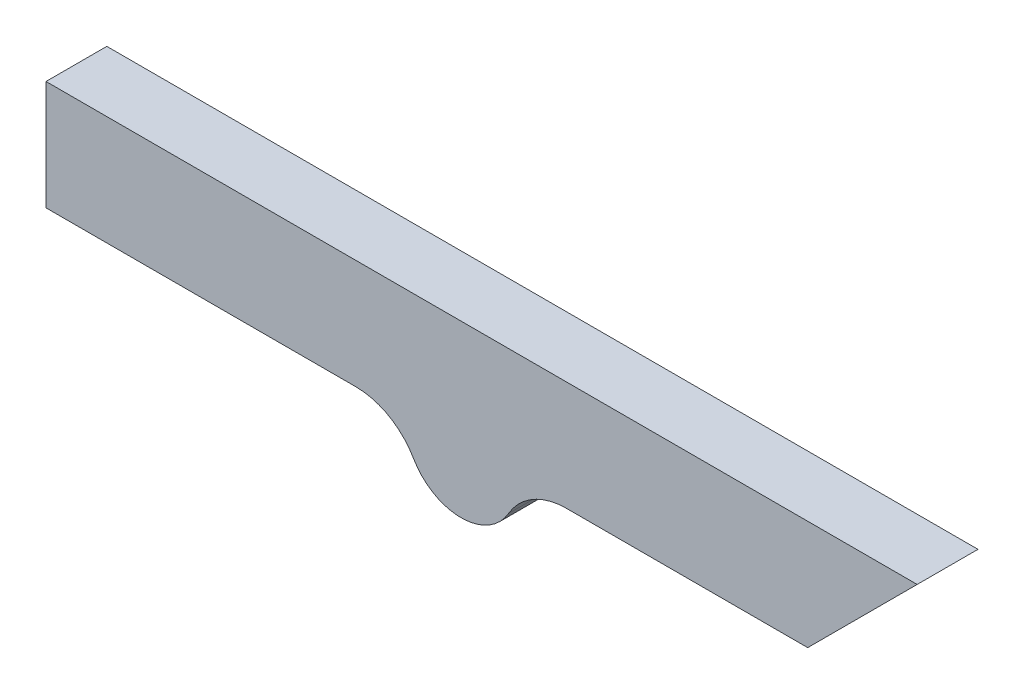
ISO-10303-21;
HEADER;
FILE_DESCRIPTION(('STEP AP214'),'2;1');
FILE_NAME('part.step','',(''),(''),'','','');
FILE_SCHEMA(('AUTOMOTIVE_DESIGN { 1 0 10303 214 1 1 1 1 }'));
ENDSEC;
DATA;
#1=APPLICATION_CONTEXT('core data for automotive mechanical design processes');
#2=APPLICATION_PROTOCOL_DEFINITION('international standard','automotive_design',2000,#1);
#3=PRODUCT_CONTEXT('',#1,'mechanical');
#4=PRODUCT('Part','Part','',(#3));
#5=PRODUCT_RELATED_PRODUCT_CATEGORY('part','',(#4));
#6=PRODUCT_DEFINITION_FORMATION('','',#4);
#7=PRODUCT_DEFINITION_CONTEXT('part definition',#1,'design');
#8=PRODUCT_DEFINITION('design','',#6,#7);
#9=PRODUCT_DEFINITION_SHAPE('','',#8);
#10=(LENGTH_UNIT() NAMED_UNIT(*) SI_UNIT(.MILLI.,.METRE.));
#11=(NAMED_UNIT(*) PLANE_ANGLE_UNIT() SI_UNIT($,.RADIAN.));
#12=(NAMED_UNIT(*) SI_UNIT($,.STERADIAN.) SOLID_ANGLE_UNIT());
#13=UNCERTAINTY_MEASURE_WITH_UNIT(LENGTH_MEASURE(1.E-05),#10,'distance_accuracy_value','');
#14=(GEOMETRIC_REPRESENTATION_CONTEXT(3) GLOBAL_UNCERTAINTY_ASSIGNED_CONTEXT((#13)) GLOBAL_UNIT_ASSIGNED_CONTEXT((#10,
#11,#12)) REPRESENTATION_CONTEXT('',''));
#15=CARTESIAN_POINT('',(0.,0.,0.));
#16=DIRECTION('',(0.,0.,1.));
#17=DIRECTION('',(1.,0.,0.));
#18=AXIS2_PLACEMENT_3D('',#15,#16,#17);
#19=CARTESIAN_POINT('',(17.3070508075689,10.2750000000001,1.));
#20=DIRECTION('',(0.,0.,-1.));
#21=DIRECTION('',(-1.,0.,0.));
#22=AXIS2_PLACEMENT_3D('',#19,#20,#21);
#23=CYLINDRICAL_SURFACE('',#22,1.1);
#24=CARTESIAN_POINT('',(17.3070508075689,10.2750000000001,0.));
#25=DIRECTION('',(0.,0.,1.));
#26=DIRECTION('',(1.,0.,0.));
#27=AXIS2_PLACEMENT_3D('',#24,#25,#26);
#28=CIRCLE('',#27,1.1);
#29=CARTESIAN_POINT('',(17.3070508075689,11.3750000000001,0.));
#30=VERTEX_POINT('',#29);
#31=CARTESIAN_POINT('',(16.354422863406,10.8250000000001,0.));
#32=VERTEX_POINT('',#31);
#33=EDGE_CURVE('E128',#30,#32,#28,.T.);
#34=ORIENTED_EDGE('',*,*,#33,.F.);
#35=DIRECTION('',(0.,0.,-1.));
#36=VECTOR('',#35,1.);
#37=CARTESIAN_POINT('',(17.3070508075689,11.3750000000001,1.));
#38=LINE('',#37,#36);
#39=CARTESIAN_POINT('',(17.3070508075689,11.3750000000001,1.));
#40=VERTEX_POINT('',#39);
#41=EDGE_CURVE('E11',#40,#30,#38,.T.);
#42=ORIENTED_EDGE('',*,*,#41,.F.);
#43=CARTESIAN_POINT('',(17.3070508075689,10.2750000000001,1.));
#44=DIRECTION('',(0.,0.,1.));
#45=DIRECTION('',(1.,0.,0.));
#46=AXIS2_PLACEMENT_3D('',#43,#44,#45);
#47=CIRCLE('',#46,1.1);
#48=CARTESIAN_POINT('',(16.354422863406,10.8250000000001,1.));
#49=VERTEX_POINT('',#48);
#50=EDGE_CURVE('E144',#40,#49,#47,.T.);
#51=ORIENTED_EDGE('',*,*,#50,.T.);
#52=DIRECTION('',(0.,0.,-1.));
#53=VECTOR('',#52,1.);
#54=CARTESIAN_POINT('',(16.354422863406,10.8250000000001,1.));
#55=LINE('',#54,#53);
#56=EDGE_CURVE('E84',#49,#32,#55,.T.);
#57=ORIENTED_EDGE('',*,*,#56,.T.);
#58=EDGE_LOOP('',(#34,#42,#51,#57));
#59=FACE_BOUND('',#58,.T.);
#60=ADVANCED_FACE('F34',(#59),#23,.F.);
#61=CARTESIAN_POINT('',(0.,11.3750000000001,1.));
#62=DIRECTION('',(0.,1.,0.));
#63=DIRECTION('',(-1.,0.,0.));
#64=AXIS2_PLACEMENT_3D('',#61,#62,#63);
#65=PLANE('',#64);
#66=DIRECTION('',(1.,0.,0.));
#67=VECTOR('',#66,1.);
#68=CARTESIAN_POINT('',(0.,11.3750000000001,0.));
#69=LINE('',#68,#67);
#70=CARTESIAN_POINT('',(21.2744949366118,11.3750000000001,0.));
#71=VERTEX_POINT('',#70);
#72=EDGE_CURVE('E131',#30,#71,#69,.T.);
#73=ORIENTED_EDGE('',*,*,#72,.T.);
#74=DIRECTION('',(0.,0.,-1.));
#75=VECTOR('',#74,1.);
#76=CARTESIAN_POINT('',(21.2744949366118,11.3750000000001,1.));
#77=LINE('',#76,#75);
#78=CARTESIAN_POINT('',(21.2744949366118,11.3750000000001,1.));
#79=VERTEX_POINT('',#78);
#80=EDGE_CURVE('E42',#79,#71,#77,.T.);
#81=ORIENTED_EDGE('',*,*,#80,.F.);
#82=DIRECTION('',(1.,0.,0.));
#83=VECTOR('',#82,1.);
#84=CARTESIAN_POINT('',(0.,11.3750000000001,1.));
#85=LINE('',#84,#83);
#86=EDGE_CURVE('E177',#40,#79,#85,.T.);
#87=ORIENTED_EDGE('',*,*,#86,.F.);
#88=ORIENTED_EDGE('',*,*,#41,.T.);
#89=EDGE_LOOP('',(#73,#81,#87,#88));
#90=FACE_BOUND('',#89,.T.);
#91=ADVANCED_FACE('F179',(#90),#65,.F.);
#92=CARTESIAN_POINT('',(4.94974746830591,-4.94974746830588,1.));
#93=DIRECTION('',(-0.707106781186549,0.707106781186546,0.));
#94=DIRECTION('',(-0.707106781186546,-0.707106781186549,0.));
#95=AXIS2_PLACEMENT_3D('',#92,#93,#94);
#96=PLANE('',#95);
#97=DIRECTION('',(0.707106781186546,0.707106781186549,0.));
#98=VECTOR('',#97,1.);
#99=CARTESIAN_POINT('',(4.94974746830591,-4.94974746830588,0.));
#100=LINE('',#99,#98);
#101=CARTESIAN_POINT('',(23.0744949366117,13.175,0.));
#102=VERTEX_POINT('',#101);
#103=EDGE_CURVE('E133',#71,#102,#100,.T.);
#104=ORIENTED_EDGE('',*,*,#103,.T.);
#105=DIRECTION('',(0.,0.,-1.));
#106=VECTOR('',#105,1.);
#107=CARTESIAN_POINT('',(23.0744949366117,13.175,1.));
#108=LINE('',#107,#106);
#109=CARTESIAN_POINT('',(23.0744949366117,13.175,1.));
#110=VERTEX_POINT('',#109);
#111=EDGE_CURVE('E151',#110,#102,#108,.T.);
#112=ORIENTED_EDGE('',*,*,#111,.F.);
#113=DIRECTION('',(0.707106781186546,0.707106781186549,0.));
#114=VECTOR('',#113,1.);
#115=CARTESIAN_POINT('',(4.94974746830591,-4.94974746830588,1.));
#116=LINE('',#115,#114);
#117=EDGE_CURVE('E160',#79,#110,#116,.T.);
#118=ORIENTED_EDGE('',*,*,#117,.F.);
#119=ORIENTED_EDGE('',*,*,#80,.T.);
#120=EDGE_LOOP('',(#104,#112,#118,#119));
#121=FACE_BOUND('',#120,.T.);
#122=ADVANCED_FACE('F158',(#121),#96,.F.);
#123=CARTESIAN_POINT('',(0.,13.175,1.));
#124=DIRECTION('',(0.,-1.,0.));
#125=DIRECTION('',(0.,0.,-1.));
#126=AXIS2_PLACEMENT_3D('',#123,#124,#125);
#127=PLANE('',#126);
#128=DIRECTION('',(-1.,0.,0.));
#129=VECTOR('',#128,1.);
#130=CARTESIAN_POINT('',(0.,13.175,0.));
#131=LINE('',#130,#129);
#132=CARTESIAN_POINT('',(8.75000000000008,13.175,0.));
#133=VERTEX_POINT('',#132);
#134=EDGE_CURVE('E135',#102,#133,#131,.T.);
#135=ORIENTED_EDGE('',*,*,#134,.T.);
#136=DIRECTION('',(0.,0.,-1.));
#137=VECTOR('',#136,1.);
#138=CARTESIAN_POINT('',(8.75000000000008,13.175,1.));
#139=LINE('',#138,#137);
#140=CARTESIAN_POINT('',(8.75000000000008,13.175,1.));
#141=VERTEX_POINT('',#140);
#142=EDGE_CURVE('E148',#141,#133,#139,.T.);
#143=ORIENTED_EDGE('',*,*,#142,.F.);
#144=DIRECTION('',(-1.,0.,0.));
#145=VECTOR('',#144,1.);
#146=CARTESIAN_POINT('',(0.,13.175,1.));
#147=LINE('',#146,#145);
#148=EDGE_CURVE('E173',#110,#141,#147,.T.);
#149=ORIENTED_EDGE('',*,*,#148,.F.);
#150=ORIENTED_EDGE('',*,*,#111,.T.);
#151=EDGE_LOOP('',(#135,#143,#149,#150));
#152=FACE_BOUND('',#151,.T.);
#153=ADVANCED_FACE('F169',(#152),#127,.F.);
#154=CARTESIAN_POINT('',(8.75000000000008,0.,1.));
#155=DIRECTION('',(1.,0.,0.));
#156=DIRECTION('',(0.,0.,-1.));
#157=AXIS2_PLACEMENT_3D('',#154,#155,#156);
#158=PLANE('',#157);
#159=DIRECTION('',(0.,-1.,0.));
#160=VECTOR('',#159,1.);
#161=CARTESIAN_POINT('',(8.75000000000008,0.,0.));
#162=LINE('',#161,#160);
#163=CARTESIAN_POINT('',(8.75000000000008,11.3750000000001,0.));
#164=VERTEX_POINT('',#163);
#165=EDGE_CURVE('E137',#133,#164,#162,.T.);
#166=ORIENTED_EDGE('',*,*,#165,.T.);
#167=DIRECTION('',(0.,0.,-1.));
#168=VECTOR('',#167,1.);
#169=CARTESIAN_POINT('',(8.75000000000008,11.3750000000001,1.));
#170=LINE('',#169,#168);
#171=CARTESIAN_POINT('',(8.75000000000008,11.3750000000001,1.));
#172=VERTEX_POINT('',#171);
#173=EDGE_CURVE('E121',#172,#164,#170,.T.);
#174=ORIENTED_EDGE('',*,*,#173,.F.);
#175=DIRECTION('',(0.,-1.,0.));
#176=VECTOR('',#175,1.);
#177=CARTESIAN_POINT('',(8.75000000000008,0.,1.));
#178=LINE('',#177,#176);
#179=EDGE_CURVE('E108',#141,#172,#178,.T.);
#180=ORIENTED_EDGE('',*,*,#179,.F.);
#181=ORIENTED_EDGE('',*,*,#142,.T.);
#182=EDGE_LOOP('',(#166,#174,#180,#181));
#183=FACE_BOUND('',#182,.T.);
#184=ADVANCED_FACE('F172',(#183),#158,.F.);
#185=CARTESIAN_POINT('',(0.,11.375,1.));
#186=DIRECTION('',(0.,1.,0.));
#187=DIRECTION('',(0.,0.,1.));
#188=AXIS2_PLACEMENT_3D('',#185,#186,#187);
#189=PLANE('',#188);
#190=DIRECTION('',(1.,0.,0.));
#191=VECTOR('',#190,1.);
#192=CARTESIAN_POINT('',(0.,11.375,0.));
#193=LINE('',#192,#191);
#194=CARTESIAN_POINT('',(13.8429491924311,11.375,0.));
#195=VERTEX_POINT('',#194);
#196=EDGE_CURVE('E117',#164,#195,#193,.T.);
#197=ORIENTED_EDGE('',*,*,#196,.T.);
#198=DIRECTION('',(0.,0.,-1.));
#199=VECTOR('',#198,1.);
#200=CARTESIAN_POINT('',(13.8429491924311,11.375,1.));
#201=LINE('',#200,#199);
#202=CARTESIAN_POINT('',(13.8429491924311,11.375,1.));
#203=VERTEX_POINT('',#202);
#204=EDGE_CURVE('E114',#203,#195,#201,.T.);
#205=ORIENTED_EDGE('',*,*,#204,.F.);
#206=DIRECTION('',(1.,0.,0.));
#207=VECTOR('',#206,1.);
#208=CARTESIAN_POINT('',(0.,11.375,1.));
#209=LINE('',#208,#207);
#210=EDGE_CURVE('E102',#172,#203,#209,.T.);
#211=ORIENTED_EDGE('',*,*,#210,.F.);
#212=ORIENTED_EDGE('',*,*,#173,.T.);
#213=EDGE_LOOP('',(#197,#205,#211,#212));
#214=FACE_BOUND('',#213,.T.);
#215=ADVANCED_FACE('F115',(#214),#189,.F.);
#216=CARTESIAN_POINT('',(13.8429491924311,10.2750000000001,1.));
#217=DIRECTION('',(0.,0.,-1.));
#218=DIRECTION('',(-1.,0.,0.));
#219=AXIS2_PLACEMENT_3D('',#216,#217,#218);
#220=CYLINDRICAL_SURFACE('',#219,1.09999999999999);
#221=CARTESIAN_POINT('',(13.8429491924311,10.2750000000001,0.));
#222=DIRECTION('',(0.,0.,1.));
#223=DIRECTION('',(1.,0.,0.));
#224=AXIS2_PLACEMENT_3D('',#221,#222,#223);
#225=CIRCLE('',#224,1.09999999999999);
#226=CARTESIAN_POINT('',(14.795577136594,10.8250000000001,0.));
#227=VERTEX_POINT('',#226);
#228=EDGE_CURVE('E140',#227,#195,#225,.T.);
#229=ORIENTED_EDGE('',*,*,#228,.F.);
#230=DIRECTION('',(0.,0.,-1.));
#231=VECTOR('',#230,1.);
#232=CARTESIAN_POINT('',(14.795577136594,10.8250000000001,1.));
#233=LINE('',#232,#231);
#234=CARTESIAN_POINT('',(14.795577136594,10.8250000000001,1.));
#235=VERTEX_POINT('',#234);
#236=EDGE_CURVE('E77',#235,#227,#233,.T.);
#237=ORIENTED_EDGE('',*,*,#236,.F.);
#238=CARTESIAN_POINT('',(13.8429491924311,10.2750000000001,1.));
#239=DIRECTION('',(0.,0.,1.));
#240=DIRECTION('',(1.,0.,0.));
#241=AXIS2_PLACEMENT_3D('',#238,#239,#240);
#242=CIRCLE('',#241,1.09999999999999);
#243=EDGE_CURVE('E106',#235,#203,#242,.T.);
#244=ORIENTED_EDGE('',*,*,#243,.T.);
#245=ORIENTED_EDGE('',*,*,#204,.T.);
#246=EDGE_LOOP('',(#229,#237,#244,#245));
#247=FACE_BOUND('',#246,.T.);
#248=ADVANCED_FACE('F123',(#247),#220,.F.);
#249=CARTESIAN_POINT('',(15.575,11.2750000000001,1.));
#250=DIRECTION('',(0.,0.,-1.));
#251=DIRECTION('',(-1.,0.,0.));
#252=AXIS2_PLACEMENT_3D('',#249,#250,#251);
#253=CYLINDRICAL_SURFACE('',#252,0.900000000000001);
#254=CARTESIAN_POINT('',(15.575,11.2750000000001,0.));
#255=DIRECTION('',(0.,0.,1.));
#256=DIRECTION('',(1.,0.,0.));
#257=AXIS2_PLACEMENT_3D('',#254,#255,#256);
#258=CIRCLE('',#257,0.900000000000001);
#259=EDGE_CURVE('E142',#227,#32,#258,.T.);
#260=ORIENTED_EDGE('',*,*,#259,.T.);
#261=ORIENTED_EDGE('',*,*,#56,.F.);
#262=CARTESIAN_POINT('',(15.575,11.2750000000001,1.));
#263=DIRECTION('',(0.,0.,1.));
#264=DIRECTION('',(1.,0.,0.));
#265=AXIS2_PLACEMENT_3D('',#262,#263,#264);
#266=CIRCLE('',#265,0.900000000000001);
#267=EDGE_CURVE('E50',#235,#49,#266,.T.);
#268=ORIENTED_EDGE('',*,*,#267,.F.);
#269=ORIENTED_EDGE('',*,*,#236,.T.);
#270=EDGE_LOOP('',(#260,#261,#268,#269));
#271=FACE_BOUND('',#270,.T.);
#272=ADVANCED_FACE('F195',(#271),#253,.T.);
#273=CARTESIAN_POINT('',(0.,0.,1.));
#274=DIRECTION('',(0.,0.,1.));
#275=DIRECTION('',(1.,0.,0.));
#276=AXIS2_PLACEMENT_3D('',#273,#274,#275);
#277=PLANE('',#276);
#278=ORIENTED_EDGE('',*,*,#50,.F.);
#279=ORIENTED_EDGE('',*,*,#86,.T.);
#280=ORIENTED_EDGE('',*,*,#117,.T.);
#281=ORIENTED_EDGE('',*,*,#148,.T.);
#282=ORIENTED_EDGE('',*,*,#179,.T.);
#283=ORIENTED_EDGE('',*,*,#210,.T.);
#284=ORIENTED_EDGE('',*,*,#243,.F.);
#285=ORIENTED_EDGE('',*,*,#267,.T.);
#286=EDGE_LOOP('',(#278,#279,#280,#281,#282,#283,#284,#285));
#287=FACE_BOUND('',#286,.T.);
#288=ADVANCED_FACE('F104',(#287),#277,.T.);
#289=CARTESIAN_POINT('',(0.,0.,0.));
#290=DIRECTION('',(0.,0.,1.));
#291=DIRECTION('',(1.,0.,0.));
#292=AXIS2_PLACEMENT_3D('',#289,#290,#291);
#293=PLANE('',#292);
#294=ORIENTED_EDGE('',*,*,#33,.T.);
#295=ORIENTED_EDGE('',*,*,#259,.F.);
#296=ORIENTED_EDGE('',*,*,#228,.T.);
#297=ORIENTED_EDGE('',*,*,#196,.F.);
#298=ORIENTED_EDGE('',*,*,#165,.F.);
#299=ORIENTED_EDGE('',*,*,#134,.F.);
#300=ORIENTED_EDGE('',*,*,#103,.F.);
#301=ORIENTED_EDGE('',*,*,#72,.F.);
#302=EDGE_LOOP('',(#294,#295,#296,#297,#298,#299,#300,#301));
#303=FACE_BOUND('',#302,.T.);
#304=ADVANCED_FACE('F165',(#303),#293,.F.);
#305=CLOSED_SHELL('',(#60,#91,#122,#153,#184,#215,#248,#272,#288,#304));
#306=MANIFOLD_SOLID_BREP('B2',#305);
#307=ADVANCED_BREP_SHAPE_REPRESENTATION('',(#18,#306),#14);
#308=SHAPE_DEFINITION_REPRESENTATION(#9,#307);
ENDSEC;
END-ISO-10303-21;
